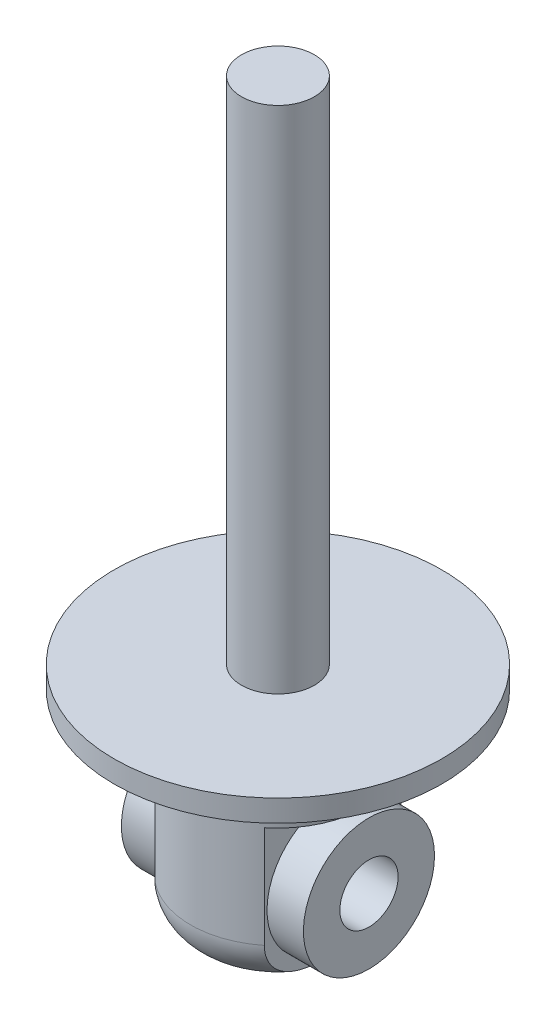
ISO-10303-21;
HEADER;
FILE_DESCRIPTION(('STEP AP214'),'2;1');
FILE_NAME('part.step','',(''),(''),'','','');
FILE_SCHEMA(('AUTOMOTIVE_DESIGN { 1 0 10303 214 1 1 1 1 }'));
ENDSEC;
DATA;
#1=APPLICATION_CONTEXT('core data for automotive mechanical design processes');
#2=APPLICATION_PROTOCOL_DEFINITION('international standard','automotive_design',2000,#1);
#3=PRODUCT_CONTEXT('',#1,'mechanical');
#4=PRODUCT('Part','Part','',(#3));
#5=PRODUCT_RELATED_PRODUCT_CATEGORY('part','',(#4));
#6=PRODUCT_DEFINITION_FORMATION('','',#4);
#7=PRODUCT_DEFINITION_CONTEXT('part definition',#1,'design');
#8=PRODUCT_DEFINITION('design','',#6,#7);
#9=PRODUCT_DEFINITION_SHAPE('','',#8);
#10=(LENGTH_UNIT() NAMED_UNIT(*) SI_UNIT(.MILLI.,.METRE.));
#11=(NAMED_UNIT(*) PLANE_ANGLE_UNIT() SI_UNIT($,.RADIAN.));
#12=(NAMED_UNIT(*) SI_UNIT($,.STERADIAN.) SOLID_ANGLE_UNIT());
#13=UNCERTAINTY_MEASURE_WITH_UNIT(LENGTH_MEASURE(1.E-05),#10,'distance_accuracy_value','');
#14=(GEOMETRIC_REPRESENTATION_CONTEXT(3) GLOBAL_UNCERTAINTY_ASSIGNED_CONTEXT((#13)) GLOBAL_UNIT_ASSIGNED_CONTEXT((#10,
#11,#12)) REPRESENTATION_CONTEXT('',''));
#15=CARTESIAN_POINT('',(0.,0.,0.));
#16=DIRECTION('',(0.,0.,1.));
#17=DIRECTION('',(1.,0.,0.));
#18=AXIS2_PLACEMENT_3D('',#15,#16,#17);
#19=CARTESIAN_POINT('',(-7.5,-8.00000000000001,-22.5));
#20=DIRECTION('',(1.,0.,0.));
#21=DIRECTION('',(0.,0.,-1.));
#22=AXIS2_PLACEMENT_3D('',#19,#20,#21);
#23=PLANE('',#22);
#24=CARTESIAN_POINT('',(-7.5,-27.8094750193111,0.));
#25=CARTESIAN_POINT('',(-7.5,-27.8094752958151,0.18452162824242));
#26=CARTESIAN_POINT('',(-7.5,-27.8077270322999,0.369043480287192));
#27=CARTESIAN_POINT('',(-7.5,-27.8006130628877,0.737999394292284));
#28=CARTESIAN_POINT('',(-7.5,-27.7952477367066,0.922433463434384));
#29=CARTESIAN_POINT('',(-7.5,-27.780538513706,1.29122559425462));
#30=CARTESIAN_POINT('',(-7.5,-27.7711929215574,1.47558358999919));
#31=CARTESIAN_POINT('',(-7.5,-27.7479507640883,1.84401846668315));
#32=CARTESIAN_POINT('',(-7.5,-27.734054140347,2.02809534398339));
#33=CARTESIAN_POINT('',(-7.5,-27.701027325669,2.39498843631837));
#34=CARTESIAN_POINT('',(-7.5,-27.6819201299087,2.57780665418326));
#35=CARTESIAN_POINT('',(-7.5,-27.6375682217561,2.94269408038083));
#36=CARTESIAN_POINT('',(-7.5,-27.6123230495969,3.12476323156505));
#37=CARTESIAN_POINT('',(-7.5,-27.5259360262262,3.6691632505479));
#38=CARTESIAN_POINT('',(-7.5,-27.4541196223952,4.02997739530099));
#39=CARTESIAN_POINT('',(-7.5,-27.315114172541,4.57935988961709));
#40=CARTESIAN_POINT('',(-7.5,-27.2608348848703,4.77122256452969));
#41=CARTESIAN_POINT('',(-7.5,-27.1402411036094,5.15109529504943));
#42=CARTESIAN_POINT('',(-7.5,-27.0739312594077,5.33910680786539));
#43=CARTESIAN_POINT('',(-7.5,-26.9281486989919,5.70992505463463));
#44=CARTESIAN_POINT('',(-7.5,-26.8486797977089,5.8927332791208));
#45=CARTESIAN_POINT('',(-7.5,-26.6756224712841,6.25155879665883));
#46=CARTESIAN_POINT('',(-7.5,-26.5820364486501,6.4275772388346));
#47=CARTESIAN_POINT('',(-7.5,-26.3958384208508,6.74413785402998));
#48=CARTESIAN_POINT('',(-7.5,-26.3053527427416,6.8859302136676));
#49=CARTESIAN_POINT('',(-7.5,-26.1136422044668,7.16205254122039));
#50=CARTESIAN_POINT('',(-7.5,-26.0124194056704,7.29638393401336));
#51=CARTESIAN_POINT('',(-7.5,-25.7991822855038,7.55627452274062));
#52=CARTESIAN_POINT('',(-7.5,-25.6871652583255,7.6818315054992));
#53=CARTESIAN_POINT('',(-7.5,-25.4525813942248,7.92270374400352));
#54=CARTESIAN_POINT('',(-7.5,-25.3300144777409,8.03801892249803));
#55=CARTESIAN_POINT('',(-7.5,-25.0736714823962,8.25792234562975));
#56=CARTESIAN_POINT('',(-7.5,-24.9398051473305,8.36240569865935));
#57=CARTESIAN_POINT('',(-7.5,-24.662616920615,8.55796576900282));
#58=CARTESIAN_POINT('',(-7.5,-24.5192963548439,8.64904436046083));
#59=CARTESIAN_POINT('',(-7.5,-24.2243409104845,8.81636481076627));
#60=CARTESIAN_POINT('',(-7.5,-24.0727112205184,8.89261579636784));
#61=CARTESIAN_POINT('',(-7.5,-23.7624095052739,9.02909243430965));
#62=CARTESIAN_POINT('',(-7.5,-23.6037388369551,9.08932115899453));
#63=CARTESIAN_POINT('',(-7.5,-23.3052245459151,9.1849514334904));
#64=CARTESIAN_POINT('',(-7.5,-23.1661361294911,9.22272405795734));
#65=CARTESIAN_POINT('',(-7.5,-22.8851087613884,9.28547940350164));
#66=CARTESIAN_POINT('',(-7.5,-22.7431701638949,9.31046370365637));
#67=CARTESIAN_POINT('',(-7.5,-22.4576599589478,9.34730641699016));
#68=CARTESIAN_POINT('',(-7.5,-22.3140890586128,9.35917031033292));
#69=CARTESIAN_POINT('',(-7.5,-22.0264648581988,9.36963164548865));
#70=CARTESIAN_POINT('',(-7.5,-21.8824115750842,9.36822954903947));
#71=CARTESIAN_POINT('',(-7.5,-21.6061914815275,9.35280339576898));
#72=CARTESIAN_POINT('',(-7.5,-21.4739684759153,9.33976569953801));
#73=CARTESIAN_POINT('',(-7.5,-21.2110534946456,9.30256363878721));
#74=CARTESIAN_POINT('',(-7.5,-21.0803620180608,9.27839574533066));
#75=CARTESIAN_POINT('',(-7.5,-20.8215410609612,9.21922065645586));
#76=CARTESIAN_POINT('',(-7.5,-20.6934101253726,9.1842198149556));
#77=CARTESIAN_POINT('',(-7.5,-20.4404340442512,9.1037455253616));
#78=CARTESIAN_POINT('',(-7.5,-20.3155901493276,9.05826815366643));
#79=CARTESIAN_POINT('',(-7.5,-20.0692031015505,8.95699564520569));
#80=CARTESIAN_POINT('',(-7.5,-19.9476868658852,8.90113499399755));
#81=CARTESIAN_POINT('',(-7.5,-19.7094920695403,8.77987692751896));
#82=CARTESIAN_POINT('',(-7.5,-19.5928152563103,8.71447610526943));
#83=CARTESIAN_POINT('',(-7.5,-19.2509911073174,8.50489875856371));
#84=CARTESIAN_POINT('',(-7.5,-19.0339195251877,8.34729299116934));
#85=CARTESIAN_POINT('',(-7.5,-18.609337427954,7.98870608163153));
#86=CARTESIAN_POINT('',(-7.5,-18.4039002281567,7.78529755950601));
#87=CARTESIAN_POINT('',(-7.5,-18.0246758733926,7.35109040646743));
#88=CARTESIAN_POINT('',(-7.5,-17.8508837047537,7.12029612399674));
#89=CARTESIAN_POINT('',(-7.5,-17.5744409595824,6.69864287979115));
#90=CARTESIAN_POINT('',(-7.5,-17.4648689537028,6.51223410047273));
#91=CARTESIAN_POINT('',(-7.5,-17.2626904112622,6.13034538679086));
#92=CARTESIAN_POINT('',(-7.5,-17.1700919878543,5.93486117014358));
#93=CARTESIAN_POINT('',(-7.5,-17.0006313082269,5.53658641063457));
#94=CARTESIAN_POINT('',(-7.5,-16.9238147555949,5.3337765932138));
#95=CARTESIAN_POINT('',(-7.5,-16.784875362625,4.9233142846081));
#96=CARTESIAN_POINT('',(-7.5,-16.7227484430634,4.71566315546474));
#97=CARTESIAN_POINT('',(-7.5,-16.5386673542946,4.02250667384635));
#98=CARTESIAN_POINT('',(-7.5,-16.4449803111871,3.52942656369881));
#99=CARTESIAN_POINT('',(-7.5,-16.3412352530644,2.78498720051466));
#100=CARTESIAN_POINT('',(-7.5,-16.3127705467372,2.53568557770049));
#101=CARTESIAN_POINT('',(-7.5,-16.2658269581612,2.03612434937438));
#102=CARTESIAN_POINT('',(-7.5,-16.2473468655649,1.78586486368141));
#103=CARTESIAN_POINT('',(-7.5,-16.2184283009414,1.28363112408652));
#104=CARTESIAN_POINT('',(-7.5,-16.208031590786,1.03165466176091));
#105=CARTESIAN_POINT('',(-7.5,-16.1941849220444,0.527501194688673));
#106=CARTESIAN_POINT('',(-7.5,-16.1907352988047,0.275324180848904));
#107=CARTESIAN_POINT('',(-7.5,-16.1903333462322,-0.228731345602983));
#108=CARTESIAN_POINT('',(-7.5,-16.193373232494,-0.480609853630182));
#109=CARTESIAN_POINT('',(-7.5,-16.2063332691715,-0.984173581494274));
#110=CARTESIAN_POINT('',(-7.5,-16.2162528039696,-1.23585881660875));
#111=CARTESIAN_POINT('',(-7.5,-16.2454935008677,-1.76278825668934));
#112=CARTESIAN_POINT('',(-7.5,-16.2656211327378,-2.03798990109172));
#113=CARTESIAN_POINT('',(-7.5,-16.3180418431018,-2.58731345976839));
#114=CARTESIAN_POINT('',(-7.5,-16.3503365349836,-2.86143522597444));
#115=CARTESIAN_POINT('',(-7.5,-16.4300545548583,-3.40623279358437));
#116=CARTESIAN_POINT('',(-7.5,-16.4774071358833,-3.67691867401873));
#117=CARTESIAN_POINT('',(-7.5,-16.5907053400646,-4.21439476079952));
#118=CARTESIAN_POINT('',(-7.5,-16.6566449229111,-4.4811862031647));
#119=CARTESIAN_POINT('',(-7.5,-16.7911834026755,-4.94217748017443));
#120=CARTESIAN_POINT('',(-7.5,-16.8549558474619,-5.13778160857807));
#121=CARTESIAN_POINT('',(-7.5,-16.9961265709521,-5.52399422741739));
#122=CARTESIAN_POINT('',(-7.5,-17.0735207892669,-5.71460418712136));
#123=CARTESIAN_POINT('',(-7.5,-17.2430793617625,-6.08921987221889));
#124=CARTESIAN_POINT('',(-7.5,-17.3352463319138,-6.27322442084438));
#125=CARTESIAN_POINT('',(-7.5,-17.5351759469553,-6.63256976145457));
#126=CARTESIAN_POINT('',(-7.5,-17.6429345063483,-6.80791280693598));
#127=CARTESIAN_POINT('',(-7.5,-17.8487615005736,-7.10989658300674));
#128=CARTESIAN_POINT('',(-7.5,-17.9436617626469,-7.23870103997639));
#129=CARTESIAN_POINT('',(-7.5,-18.143229826346,-7.48856622066219));
#130=CARTESIAN_POINT('',(-7.5,-18.2478987883735,-7.60962602152205));
#131=CARTESIAN_POINT('',(-7.5,-18.4668045949393,-7.84271387792474));
#132=CARTESIAN_POINT('',(-7.5,-18.5810384459287,-7.95474473789612));
#133=CARTESIAN_POINT('',(-7.5,-18.8187268203134,-8.16854933672494));
#134=CARTESIAN_POINT('',(-7.5,-18.9421800591116,-8.27032449994957));
#135=CARTESIAN_POINT('',(-7.5,-19.1987356397018,-8.46313596223061));
#136=CARTESIAN_POINT('',(-7.5,-19.3319055781875,-8.55408255407203));
#137=CARTESIAN_POINT('',(-7.5,-19.6061418402457,-8.72304401015934));
#138=CARTESIAN_POINT('',(-7.5,-19.747204378254,-8.80106500403696));
#139=CARTESIAN_POINT('',(-7.5,-20.0362068877473,-8.94309470867639));
#140=CARTESIAN_POINT('',(-7.5,-20.1841460034049,-9.00710515749598));
#141=CARTESIAN_POINT('',(-7.5,-20.4856380297523,-9.12014361193693));
#142=CARTESIAN_POINT('',(-7.5,-20.6391901444676,-9.16917373274798));
#143=CARTESIAN_POINT('',(-7.5,-20.9313639562727,-9.24643392787081));
#144=CARTESIAN_POINT('',(-7.5,-21.0695088202567,-9.27647685632879));
#145=CARTESIAN_POINT('',(-7.5,-21.3479315795213,-9.32406143536891));
#146=CARTESIAN_POINT('',(-7.5,-21.4882092809526,-9.34160421520928));
#147=CARTESIAN_POINT('',(-7.5,-21.769719609589,-9.36396002322679));
#148=CARTESIAN_POINT('',(-7.5,-21.9109518422674,-9.36877802253041));
#149=CARTESIAN_POINT('',(-7.5,-22.1932734390957,-9.3656361390626));
#150=CARTESIAN_POINT('',(-7.5,-22.3343628067459,-9.35767657732182));
#151=CARTESIAN_POINT('',(-7.5,-22.6064011749062,-9.32998563551062));
#152=CARTESIAN_POINT('',(-7.5,-22.7374295539783,-9.31102660205279));
#153=CARTESIAN_POINT('',(-7.5,-22.9974780227225,-9.26218788836622));
#154=CARTESIAN_POINT('',(-7.5,-23.1264974548056,-9.23230470755187));
#155=CARTESIAN_POINT('',(-7.5,-23.3815508516768,-9.16196479385525));
#156=CARTESIAN_POINT('',(-7.5,-23.5075862018083,-9.12151307666088));
#157=CARTESIAN_POINT('',(-7.5,-23.7559772755244,-9.03044888037393));
#158=CARTESIAN_POINT('',(-7.5,-23.8783315975104,-8.97983258590814));
#159=CARTESIAN_POINT('',(-7.5,-24.1205569584555,-8.8680617574251));
#160=CARTESIAN_POINT('',(-7.5,-24.2403549182387,-8.80674877020291));
#161=CARTESIAN_POINT('',(-7.5,-24.4747211723639,-8.67480187441993));
#162=CARTESIAN_POINT('',(-7.5,-24.5892875713423,-8.60416462323317));
#163=CARTESIAN_POINT('',(-7.5,-24.9242270275788,-8.37928997825773));
#164=CARTESIAN_POINT('',(-7.5,-25.13600210755,-8.21201407264852));
#165=CARTESIAN_POINT('',(-7.5,-25.5504485361803,-7.832942739178));
#166=CARTESIAN_POINT('',(-7.5,-25.7507010772538,-7.618532285847));
#167=CARTESIAN_POINT('',(-7.5,-26.1185076671662,-7.16337882817298));
#168=CARTESIAN_POINT('',(-7.5,-26.2860513710234,-6.9226275303298));
#169=CARTESIAN_POINT('',(-7.5,-26.5545024709803,-6.4788664395953));
#170=CARTESIAN_POINT('',(-7.5,-26.6619013252763,-6.279707295078));
#171=CARTESIAN_POINT('',(-7.5,-26.858559219587,-5.87254463104013));
#172=CARTESIAN_POINT('',(-7.5,-26.9478095430477,-5.66453691936401));
#173=CARTESIAN_POINT('',(-7.5,-27.1096214973705,-5.24180758530233));
#174=CARTESIAN_POINT('',(-7.5,-27.1821555960046,-5.02707553901332));
#175=CARTESIAN_POINT('',(-7.5,-27.3121001369762,-4.59305326757356));
#176=CARTESIAN_POINT('',(-7.5,-27.3695048137837,-4.37376133898657));
#177=CARTESIAN_POINT('',(-7.5,-27.4981886749365,-3.81417726059937));
#178=CARTESIAN_POINT('',(-7.5,-27.5604951716191,-3.47183296905169));
#179=CARTESIAN_POINT('',(-7.5,-27.6609019684328,-2.78359200614869));
#180=CARTESIAN_POINT('',(-7.5,-27.6989863972919,-2.43769315620305));
#181=CARTESIAN_POINT('',(-7.5,-27.7425563308733,-1.91723181279188));
#182=CARTESIAN_POINT('',(-7.5,-27.7548291128016,-1.74318957751326));
#183=CARTESIAN_POINT('',(-7.5,-27.7753986995787,-1.39487161182967));
#184=CARTESIAN_POINT('',(-7.5,-27.7836956019396,-1.22059588725638));
#185=CARTESIAN_POINT('',(-7.5,-27.796777523185,-0.871965392986039));
#186=CARTESIAN_POINT('',(-7.5,-27.8015635129394,-0.69761065849217));
#187=CARTESIAN_POINT('',(-7.5,-27.8079121855994,-0.348837350643893));
#188=CARTESIAN_POINT('',(-7.5,-27.8094747579462,-0.174418775305038));
#189=CARTESIAN_POINT('',(-7.5,-27.8094750193111,0.));
#190=B_SPLINE_CURVE_WITH_KNOTS('',3,(#24,#25,#26,#27,#28,#29,#30,#31,#32,#33,#34,#35,#36,#37,
#38,#39,#40,#41,#42,#43,#44,#45,#46,#47,#48,#49,#50,#51,#52,#53,#54,#55,#56,#57,#58,#59,#60,#61,
#62,#63,#64,#65,#66,#67,#68,#69,#70,#71,#72,#73,#74,#75,#76,#77,#78,#79,#80,#81,#82,#83,#84,#85,
#86,#87,#88,#89,#90,#91,#92,#93,#94,#95,#96,#97,#98,#99,#100,#101,#102,#103,#104,#105,#106,#107,
#108,#109,#110,#111,#112,#113,#114,#115,#116,#117,#118,#119,#120,#121,#122,#123,#124,#125,#126,
#127,#128,#129,#130,#131,#132,#133,#134,#135,#136,#137,#138,#139,#140,#141,#142,#143,#144,#145,
#146,#147,#148,#149,#150,#151,#152,#153,#154,#155,#156,#157,#158,#159,#160,#161,#162,#163,#164,
#165,#166,#167,#168,#169,#170,#171,#172,#173,#174,#175,#176,#177,#178,#179,#180,#181,#182,#183,
#184,#185,#186,#187,#188,#189),.UNSPECIFIED.,.T.,.F.,(4,2,2,2,2,2,2,2,2,2,2,2,2,2,2,2,2,2,2,2,2,
2,2,2,2,2,2,2,2,2,2,2,2,2,2,2,2,2,2,2,2,2,2,2,2,2,2,2,2,2,2,2,2,2,2,2,2,2,2,2,2,2,2,2,2,2,2,2,2,
2,2,2,2,2,2,2,2,2,2,2,2,2,4),(0.,0.553556541747908,1.10705498067111,1.66078940935171,
2.21453094651203,2.7658672034967,3.31724477121585,4.41912680182767,5.01698525599297,
5.61461314908642,6.21206808675635,6.80942146164093,7.31357153503217,7.81762499361292,
8.32180513447662,8.82598907791494,9.33467160980088,9.84328295415676,10.3515802378956,
10.8597799828438,11.291588037567,11.7233427606026,12.1549170790764,12.5864763761707,
12.9845986570771,13.3828472534997,13.7808627038906,14.1790274594522,14.579795450788,
14.9807069160888,15.7821103743006,16.6461503316802,17.5100532757815,18.1578732554314,
18.8060020817717,19.4559821948789,20.1057815998326,21.6069748462106,22.3596793389022,
23.1122925673176,23.8687687149109,24.625281377904,25.3808870860739,26.1364251884592,
26.9640249034878,27.7917343993232,28.6156111127982,29.4392203950451,30.0559954213972,
30.6725869093733,31.2892877047367,31.9058271963483,32.3853559200308,32.86494167852,
33.3443778968313,33.823747436381,34.3068464150843,34.7897156366604,35.2725249226045,
35.7552660053908,36.1788379642465,36.6023716529343,37.0257398573389,37.4490974249689,
37.8458122806135,38.2426543730445,38.639308470493,39.0361117351622,39.4393886143668,
39.8428104576492,40.6491243408277,41.5260051520067,42.4031628508039,43.0810551134699,
43.7592721958252,44.4385984678267,45.1181832448308,46.1608437011148,47.2041866484774,
47.7275747628343,48.2509500399341,48.7741805338585,49.2974289735857),.UNSPECIFIED.);
#191=CARTESIAN_POINT('',(-7.5,-22.,-9.3674969975976));
#192=VERTEX_POINT('',#191);
#193=CARTESIAN_POINT('',(-7.5,-21.9999999999999,9.36749699759766));
#194=VERTEX_POINT('',#193);
#195=EDGE_CURVE('E132',#192,#194,#190,.T.);
#196=ORIENTED_EDGE('',*,*,#195,.T.);
#197=DIRECTION('',(0.,1.,0.));
#198=VECTOR('',#197,1.);
#199=CARTESIAN_POINT('',(-7.5,-28.,9.3674969975976));
#200=LINE('',#199,#198);
#201=CARTESIAN_POINT('',(-7.5,-8.00000000000001,9.36749699759758));
#202=VERTEX_POINT('',#201);
#203=EDGE_CURVE('E95',#202,#194,#200,.F.);
#204=ORIENTED_EDGE('',*,*,#203,.F.);
#205=DIRECTION('',(0.,0.,1.));
#206=VECTOR('',#205,1.);
#207=CARTESIAN_POINT('',(-7.5,-8.00000000000001,-22.5));
#208=LINE('',#207,#206);
#209=CARTESIAN_POINT('',(-7.5,-8.00000000000001,-9.36749699759761));
#210=VERTEX_POINT('',#209);
#211=EDGE_CURVE('E88',#210,#202,#208,.T.);
#212=ORIENTED_EDGE('',*,*,#211,.F.);
#213=DIRECTION('',(0.,1.,0.));
#214=VECTOR('',#213,1.);
#215=CARTESIAN_POINT('',(-7.5,-28.,-9.3674969975976));
#216=LINE('',#215,#214);
#217=EDGE_CURVE('E66',#192,#210,#216,.T.);
#218=ORIENTED_EDGE('',*,*,#217,.F.);
#219=EDGE_LOOP('',(#196,#204,#212,#218));
#220=FACE_BOUND('',#219,.T.);
#221=CARTESIAN_POINT('',(-7.5,-18.,0.));
#222=DIRECTION('',(1.,0.,0.));
#223=DIRECTION('',(0.,0.,-1.));
#224=AXIS2_PLACEMENT_3D('',#221,#222,#223);
#225=CIRCLE('',#224,9.);
#226=CARTESIAN_POINT('',(-7.5,-18.,-9.));
#227=VERTEX_POINT('',#226);
#228=EDGE_CURVE('E11',#227,#227,#225,.F.);
#229=ORIENTED_EDGE('',*,*,#228,.F.);
#230=EDGE_LOOP('',(#229));
#231=FACE_BOUND('',#230,.T.);
#232=ADVANCED_FACE('F41',(#220,#231),#23,.F.);
#233=CARTESIAN_POINT('',(7.5,-8.,-22.5));
#234=DIRECTION('',(-1.,0.,0.));
#235=DIRECTION('',(0.,-1.,0.));
#236=AXIS2_PLACEMENT_3D('',#233,#234,#235);
#237=PLANE('',#236);
#238=CARTESIAN_POINT('',(7.50000000000001,-27.8094750193111,0.));
#239=CARTESIAN_POINT('',(7.50000000000001,-27.8094752958151,-0.18452162824242));
#240=CARTESIAN_POINT('',(7.50000000000001,-27.8077270322999,-0.369043480287192));
#241=CARTESIAN_POINT('',(7.50000000000001,-27.8006130628877,-0.737999394292286));
#242=CARTESIAN_POINT('',(7.50000000000001,-27.7952477367066,-0.922433463434386));
#243=CARTESIAN_POINT('',(7.50000000000001,-27.780538513706,-1.29122559425462));
#244=CARTESIAN_POINT('',(7.50000000000001,-27.7711929215574,-1.47558358999919));
#245=CARTESIAN_POINT('',(7.50000000000001,-27.7479507640883,-1.84401846668315));
#246=CARTESIAN_POINT('',(7.50000000000001,-27.734054140347,-2.0280953439834));
#247=CARTESIAN_POINT('',(7.50000000000001,-27.701027325669,-2.39498843631837));
#248=CARTESIAN_POINT('',(7.50000000000001,-27.6819201299087,-2.57780665418327));
#249=CARTESIAN_POINT('',(7.50000000000001,-27.6375682217561,-2.94269408038084));
#250=CARTESIAN_POINT('',(7.50000000000001,-27.6123230495969,-3.12476323156505));
#251=CARTESIAN_POINT('',(7.50000000000001,-27.5259360262262,-3.6691632505479));
#252=CARTESIAN_POINT('',(7.50000000000001,-27.4541196223952,-4.029977395301));
#253=CARTESIAN_POINT('',(7.50000000000001,-27.315114172541,-4.57935988961709));
#254=CARTESIAN_POINT('',(7.50000000000001,-27.2608348848703,-4.7712225645297));
#255=CARTESIAN_POINT('',(7.50000000000001,-27.1402411036094,-5.15109529504943));
#256=CARTESIAN_POINT('',(7.50000000000001,-27.0739312594077,-5.3391068078654));
#257=CARTESIAN_POINT('',(7.50000000000001,-26.9281486989919,-5.70992505463464));
#258=CARTESIAN_POINT('',(7.50000000000001,-26.8486797977089,-5.89273327912081));
#259=CARTESIAN_POINT('',(7.50000000000001,-26.6756224712841,-6.25155879665884));
#260=CARTESIAN_POINT('',(7.50000000000001,-26.5820364486501,-6.4275772388346));
#261=CARTESIAN_POINT('',(7.50000000000001,-26.3958384208508,-6.74413785402998));
#262=CARTESIAN_POINT('',(7.5,-26.3053527427416,-6.8859302136676));
#263=CARTESIAN_POINT('',(7.5,-26.1136422044668,-7.16205254122039));
#264=CARTESIAN_POINT('',(7.5,-26.0124194056704,-7.29638393401337));
#265=CARTESIAN_POINT('',(7.5,-25.7991822855038,-7.55627452274062));
#266=CARTESIAN_POINT('',(7.5,-25.6871652583255,-7.6818315054992));
#267=CARTESIAN_POINT('',(7.5,-25.4525813942248,-7.92270374400352));
#268=CARTESIAN_POINT('',(7.5,-25.3300144777409,-8.03801892249803));
#269=CARTESIAN_POINT('',(7.5,-25.0736714823962,-8.25792234562975));
#270=CARTESIAN_POINT('',(7.5,-24.9398051473305,-8.36240569865935));
#271=CARTESIAN_POINT('',(7.5,-24.662616920615,-8.55796576900282));
#272=CARTESIAN_POINT('',(7.5,-24.5192963548439,-8.64904436046083));
#273=CARTESIAN_POINT('',(7.5,-24.2243409104845,-8.81636481076626));
#274=CARTESIAN_POINT('',(7.5,-24.0727112205184,-8.89261579636783));
#275=CARTESIAN_POINT('',(7.5,-23.7624095052739,-9.02909243430965));
#276=CARTESIAN_POINT('',(7.5,-23.6037388369551,-9.08932115899453));
#277=CARTESIAN_POINT('',(7.5,-23.3052245459151,-9.1849514334904));
#278=CARTESIAN_POINT('',(7.5,-23.166136129491,-9.22272405795733));
#279=CARTESIAN_POINT('',(7.5,-22.8851087613884,-9.28547940350164));
#280=CARTESIAN_POINT('',(7.5,-22.7431701638949,-9.31046370365637));
#281=CARTESIAN_POINT('',(7.5,-22.4576599589478,-9.34730641699015));
#282=CARTESIAN_POINT('',(7.5,-22.3140890586128,-9.35917031033291));
#283=CARTESIAN_POINT('',(7.5,-22.0264648581988,-9.36963164548865));
#284=CARTESIAN_POINT('',(7.5,-21.8824115750842,-9.36822954903947));
#285=CARTESIAN_POINT('',(7.5,-21.6061914815275,-9.35280339576898));
#286=CARTESIAN_POINT('',(7.5,-21.4739684759153,-9.33976569953801));
#287=CARTESIAN_POINT('',(7.5,-21.2110534946456,-9.3025636387872));
#288=CARTESIAN_POINT('',(7.5,-21.0803620180608,-9.27839574533065));
#289=CARTESIAN_POINT('',(7.5,-20.8215410609612,-9.21922065645585));
#290=CARTESIAN_POINT('',(7.5,-20.6934101253726,-9.1842198149556));
#291=CARTESIAN_POINT('',(7.5,-20.4404340442512,-9.1037455253616));
#292=CARTESIAN_POINT('',(7.5,-20.3155901493276,-9.05826815366643));
#293=CARTESIAN_POINT('',(7.5,-20.0692031015505,-8.95699564520569));
#294=CARTESIAN_POINT('',(7.5,-19.9476868658852,-8.90113499399755));
#295=CARTESIAN_POINT('',(7.5,-19.7094920695403,-8.77987692751896));
#296=CARTESIAN_POINT('',(7.5,-19.5928152563103,-8.71447610526942));
#297=CARTESIAN_POINT('',(7.5,-19.2509911073174,-8.50489875856371));
#298=CARTESIAN_POINT('',(7.5,-19.0339195251877,-8.34729299116934));
#299=CARTESIAN_POINT('',(7.5,-18.609337427954,-7.98870608163152));
#300=CARTESIAN_POINT('',(7.5,-18.4039002281567,-7.785297559506));
#301=CARTESIAN_POINT('',(7.5,-18.0246758733926,-7.35109040646742));
#302=CARTESIAN_POINT('',(7.5,-17.8508837047537,-7.12029612399673));
#303=CARTESIAN_POINT('',(7.5,-17.5744409595824,-6.69864287979114));
#304=CARTESIAN_POINT('',(7.5,-17.4648689537028,-6.51223410047272));
#305=CARTESIAN_POINT('',(7.5,-17.2626904112622,-6.13034538679085));
#306=CARTESIAN_POINT('',(7.5,-17.1700919878543,-5.93486117014358));
#307=CARTESIAN_POINT('',(7.5,-17.0006313082269,-5.53658641063457));
#308=CARTESIAN_POINT('',(7.5,-16.9238147555949,-5.33377659321379));
#309=CARTESIAN_POINT('',(7.5,-16.784875362625,-4.92331428460809));
#310=CARTESIAN_POINT('',(7.5,-16.7227484430634,-4.71566315546473));
#311=CARTESIAN_POINT('',(7.5,-16.5386673542946,-4.02250667384634));
#312=CARTESIAN_POINT('',(7.5,-16.4449803111871,-3.52942656369881));
#313=CARTESIAN_POINT('',(7.5,-16.3412352530644,-2.78498720051465));
#314=CARTESIAN_POINT('',(7.5,-16.3127705467372,-2.53568557770049));
#315=CARTESIAN_POINT('',(7.5,-16.2658269581612,-2.03612434937437));
#316=CARTESIAN_POINT('',(7.5,-16.2473468655649,-1.78586486368141));
#317=CARTESIAN_POINT('',(7.5,-16.2184283009414,-1.28363112408651));
#318=CARTESIAN_POINT('',(7.5,-16.208031590786,-1.0316546617609));
#319=CARTESIAN_POINT('',(7.5,-16.1941849220444,-0.52750119468867));
#320=CARTESIAN_POINT('',(7.5,-16.1907352988047,-0.275324180848901));
#321=CARTESIAN_POINT('',(7.5,-16.1903333462322,0.228731345602988));
#322=CARTESIAN_POINT('',(7.5,-16.193373232494,0.480609853630186));
#323=CARTESIAN_POINT('',(7.5,-16.2063332691715,0.984173581494278));
#324=CARTESIAN_POINT('',(7.5,-16.2162528039696,1.23585881660875));
#325=CARTESIAN_POINT('',(7.5,-16.2454935008677,1.76278825668934));
#326=CARTESIAN_POINT('',(7.5,-16.2656211327378,2.03798990109172));
#327=CARTESIAN_POINT('',(7.5,-16.3180418431018,2.58731345976839));
#328=CARTESIAN_POINT('',(7.5,-16.3503365349836,2.86143522597444));
#329=CARTESIAN_POINT('',(7.5,-16.4300545548583,3.40623279358437));
#330=CARTESIAN_POINT('',(7.5,-16.4774071358833,3.67691867401874));
#331=CARTESIAN_POINT('',(7.5,-16.5907053400646,4.21439476079952));
#332=CARTESIAN_POINT('',(7.5,-16.6566449229111,4.4811862031647));
#333=CARTESIAN_POINT('',(7.5,-16.7911834026755,4.94217748017443));
#334=CARTESIAN_POINT('',(7.5,-16.8549558474619,5.13778160857807));
#335=CARTESIAN_POINT('',(7.5,-16.9961265709521,5.5239942274174));
#336=CARTESIAN_POINT('',(7.5,-17.073520789267,5.71460418712137));
#337=CARTESIAN_POINT('',(7.5,-17.2430793617625,6.08921987221889));
#338=CARTESIAN_POINT('',(7.5,-17.3352463319138,6.27322442084438));
#339=CARTESIAN_POINT('',(7.5,-17.5351759469553,6.63256976145457));
#340=CARTESIAN_POINT('',(7.5,-17.6429345063483,6.80791280693598));
#341=CARTESIAN_POINT('',(7.5,-17.8487615005737,7.10989658300674));
#342=CARTESIAN_POINT('',(7.5,-17.9436617626469,7.23870103997639));
#343=CARTESIAN_POINT('',(7.5,-18.143229826346,7.48856622066219));
#344=CARTESIAN_POINT('',(7.5,-18.2478987883735,7.60962602152205));
#345=CARTESIAN_POINT('',(7.5,-18.4668045949393,7.84271387792474));
#346=CARTESIAN_POINT('',(7.5,-18.5810384459287,7.95474473789612));
#347=CARTESIAN_POINT('',(7.5,-18.8187268203134,8.16854933672494));
#348=CARTESIAN_POINT('',(7.5,-18.9421800591116,8.27032449994956));
#349=CARTESIAN_POINT('',(7.5,-19.1987356397018,8.46313596223061));
#350=CARTESIAN_POINT('',(7.5,-19.3319055781875,8.55408255407202));
#351=CARTESIAN_POINT('',(7.5,-19.6061418402457,8.72304401015933));
#352=CARTESIAN_POINT('',(7.5,-19.747204378254,8.80106500403695));
#353=CARTESIAN_POINT('',(7.5,-20.0362068877473,8.94309470867638));
#354=CARTESIAN_POINT('',(7.5,-20.1841460034049,9.00710515749597));
#355=CARTESIAN_POINT('',(7.5,-20.4856380297523,9.12014361193692));
#356=CARTESIAN_POINT('',(7.5,-20.6391901444676,9.16917373274798));
#357=CARTESIAN_POINT('',(7.5,-20.9313639562727,9.24643392787081));
#358=CARTESIAN_POINT('',(7.5,-21.0695088202567,9.27647685632879));
#359=CARTESIAN_POINT('',(7.5,-21.3479315795213,9.32406143536891));
#360=CARTESIAN_POINT('',(7.5,-21.4882092809527,9.34160421520927));
#361=CARTESIAN_POINT('',(7.5,-21.769719609589,9.36396002322678));
#362=CARTESIAN_POINT('',(7.5,-21.9109518422674,9.36877802253041));
#363=CARTESIAN_POINT('',(7.5,-22.1932734390957,9.3656361390626));
#364=CARTESIAN_POINT('',(7.5,-22.3343628067459,9.35767657732181));
#365=CARTESIAN_POINT('',(7.5,-22.6064011749062,9.32998563551062));
#366=CARTESIAN_POINT('',(7.5,-22.7374295539783,9.31102660205278));
#367=CARTESIAN_POINT('',(7.5,-22.9974780227225,9.26218788836621));
#368=CARTESIAN_POINT('',(7.5,-23.1264974548056,9.23230470755187));
#369=CARTESIAN_POINT('',(7.5,-23.3815508516768,9.16196479385525));
#370=CARTESIAN_POINT('',(7.5,-23.5075862018083,9.12151307666088));
#371=CARTESIAN_POINT('',(7.5,-23.7559772755244,9.03044888037393));
#372=CARTESIAN_POINT('',(7.5,-23.8783315975104,8.97983258590813));
#373=CARTESIAN_POINT('',(7.5,-24.1205569584555,8.86806175742509));
#374=CARTESIAN_POINT('',(7.5,-24.2403549182387,8.8067487702029));
#375=CARTESIAN_POINT('',(7.5,-24.4747211723639,8.67480187441992));
#376=CARTESIAN_POINT('',(7.5,-24.5892875713423,8.60416462323316));
#377=CARTESIAN_POINT('',(7.5,-24.9242270275788,8.37928997825773));
#378=CARTESIAN_POINT('',(7.5,-25.13600210755,8.21201407264851));
#379=CARTESIAN_POINT('',(7.5,-25.5504485361803,7.832942739178));
#380=CARTESIAN_POINT('',(7.5,-25.7507010772538,7.61853228584699));
#381=CARTESIAN_POINT('',(7.5,-26.1185076671662,7.16337882817298));
#382=CARTESIAN_POINT('',(7.50000000000001,-26.2860513710234,6.92262753032979));
#383=CARTESIAN_POINT('',(7.50000000000001,-26.5545024709803,6.47886643959529));
#384=CARTESIAN_POINT('',(7.50000000000001,-26.6619013252763,6.27970729507799));
#385=CARTESIAN_POINT('',(7.50000000000001,-26.858559219587,5.87254463104012));
#386=CARTESIAN_POINT('',(7.50000000000001,-26.9478095430477,5.664536919364));
#387=CARTESIAN_POINT('',(7.50000000000001,-27.1096214973705,5.24180758530232));
#388=CARTESIAN_POINT('',(7.50000000000001,-27.1821555960046,5.02707553901331));
#389=CARTESIAN_POINT('',(7.50000000000001,-27.3121001369762,4.59305326757355));
#390=CARTESIAN_POINT('',(7.50000000000001,-27.3695048137837,4.37376133898656));
#391=CARTESIAN_POINT('',(7.50000000000001,-27.4981886749365,3.81417726059936));
#392=CARTESIAN_POINT('',(7.50000000000001,-27.5604951716191,3.47183296905169));
#393=CARTESIAN_POINT('',(7.50000000000001,-27.6609019684328,2.78359200614869));
#394=CARTESIAN_POINT('',(7.50000000000001,-27.6989863972919,2.43769315620305));
#395=CARTESIAN_POINT('',(7.50000000000001,-27.7425563308733,1.91723181279187));
#396=CARTESIAN_POINT('',(7.50000000000001,-27.7548291128016,1.74318957751326));
#397=CARTESIAN_POINT('',(7.50000000000001,-27.7753986995787,1.39487161182967));
#398=CARTESIAN_POINT('',(7.50000000000001,-27.7836956019396,1.22059588725638));
#399=CARTESIAN_POINT('',(7.50000000000001,-27.796777523185,0.871965392986041));
#400=CARTESIAN_POINT('',(7.50000000000001,-27.8015635129394,0.697610658492173));
#401=CARTESIAN_POINT('',(7.50000000000001,-27.8079121855994,0.348837350643895));
#402=CARTESIAN_POINT('',(7.50000000000001,-27.8094747579462,0.174418775305039));
#403=CARTESIAN_POINT('',(7.50000000000001,-27.8094750193111,0.));
#404=B_SPLINE_CURVE_WITH_KNOTS('',3,(#238,#239,#240,#241,#242,#243,#244,#245,#246,#247,#248,
#249,#250,#251,#252,#253,#254,#255,#256,#257,#258,#259,#260,#261,#262,#263,#264,#265,#266,#267,
#268,#269,#270,#271,#272,#273,#274,#275,#276,#277,#278,#279,#280,#281,#282,#283,#284,#285,#286,
#287,#288,#289,#290,#291,#292,#293,#294,#295,#296,#297,#298,#299,#300,#301,#302,#303,#304,#305,
#306,#307,#308,#309,#310,#311,#312,#313,#314,#315,#316,#317,#318,#319,#320,#321,#322,#323,#324,
#325,#326,#327,#328,#329,#330,#331,#332,#333,#334,#335,#336,#337,#338,#339,#340,#341,#342,#343,
#344,#345,#346,#347,#348,#349,#350,#351,#352,#353,#354,#355,#356,#357,#358,#359,#360,#361,#362,
#363,#364,#365,#366,#367,#368,#369,#370,#371,#372,#373,#374,#375,#376,#377,#378,#379,#380,#381,
#382,#383,#384,#385,#386,#387,#388,#389,#390,#391,#392,#393,#394,#395,#396,#397,#398,#399,#400,
#401,#402,#403),.UNSPECIFIED.,.T.,.F.,(4,2,2,2,2,2,2,2,2,2,2,2,2,2,2,2,2,2,2,2,2,2,2,2,2,2,2,2,
2,2,2,2,2,2,2,2,2,2,2,2,2,2,2,2,2,2,2,2,2,2,2,2,2,2,2,2,2,2,2,2,2,2,2,2,2,2,2,2,2,2,2,2,2,2,2,2,
2,2,2,2,2,2,4),(0.,0.553556541747909,1.10705498067111,1.66078940935171,2.21453094651203,
2.7658672034967,3.31724477121586,4.41912680182767,5.01698525599298,5.61461314908643,
6.21206808675635,6.80942146164093,7.31357153503218,7.81762499361293,8.32180513447663,
8.82598907791494,9.33467160980089,9.84328295415676,10.3515802378956,10.8597799828438,
11.291588037567,11.7233427606026,12.1549170790764,12.5864763761707,12.9845986570771,
13.3828472534997,13.7808627038906,14.1790274594522,14.579795450788,14.9807069160888,
15.7821103743006,16.6461503316802,17.5100532757815,18.1578732554314,18.8060020817716,
19.4559821948789,20.1057815998326,21.6069748462106,22.3596793389022,23.1122925673176,
23.8687687149109,24.6252813779039,25.3808870860739,26.1364251884592,26.9640249034878,
27.7917343993232,28.6156111127982,29.4392203950451,30.0559954213972,30.6725869093733,
31.2892877047367,31.9058271963483,32.3853559200308,32.8649416785199,33.3443778968313,
33.823747436381,34.3068464150843,34.7897156366603,35.2725249226045,35.7552660053908,
36.1788379642465,36.6023716529343,37.0257398573389,37.4490974249689,37.8458122806135,
38.2426543730445,38.6393084704929,39.0361117351622,39.4393886143668,39.8428104576491,
40.6491243408277,41.5260051520067,42.4031628508039,43.0810551134699,43.7592721958252,
44.4385984678267,45.1181832448308,46.1608437011148,47.2041866484774,47.7275747628343,
48.2509500399341,48.7741805338585,49.2974289735857),.UNSPECIFIED.);
#405=CARTESIAN_POINT('',(7.5,-22.,9.3674969975976));
#406=VERTEX_POINT('',#405);
#407=CARTESIAN_POINT('',(7.5,-21.9999999999999,-9.36749699759765));
#408=VERTEX_POINT('',#407);
#409=EDGE_CURVE('E92',#406,#408,#404,.T.);
#410=ORIENTED_EDGE('',*,*,#409,.T.);
#411=DIRECTION('',(0.,1.,0.));
#412=VECTOR('',#411,1.);
#413=CARTESIAN_POINT('',(7.5,-28.,-9.3674969975976));
#414=LINE('',#413,#412);
#415=CARTESIAN_POINT('',(7.5,-8.,-9.3674969975976));
#416=VERTEX_POINT('',#415);
#417=EDGE_CURVE('E106',#416,#408,#414,.F.);
#418=ORIENTED_EDGE('',*,*,#417,.F.);
#419=DIRECTION('',(0.,0.,1.));
#420=VECTOR('',#419,1.);
#421=CARTESIAN_POINT('',(7.5,-8.,-22.5));
#422=LINE('',#421,#420);
#423=CARTESIAN_POINT('',(7.5,-8.,9.3674969975976));
#424=VERTEX_POINT('',#423);
#425=EDGE_CURVE('E96',#416,#424,#422,.T.);
#426=ORIENTED_EDGE('',*,*,#425,.T.);
#427=DIRECTION('',(0.,1.,0.));
#428=VECTOR('',#427,1.);
#429=CARTESIAN_POINT('',(7.5,-28.,9.3674969975976));
#430=LINE('',#429,#428);
#431=EDGE_CURVE('E58',#406,#424,#430,.T.);
#432=ORIENTED_EDGE('',*,*,#431,.F.);
#433=EDGE_LOOP('',(#410,#418,#426,#432));
#434=FACE_BOUND('',#433,.T.);
#435=CARTESIAN_POINT('',(7.5,-18.,0.));
#436=DIRECTION('',(-1.,0.,0.));
#437=DIRECTION('',(0.,-1.,0.));
#438=AXIS2_PLACEMENT_3D('',#435,#436,#437);
#439=CIRCLE('',#438,9.);
#440=CARTESIAN_POINT('',(7.50000000000001,-27.,0.));
#441=VERTEX_POINT('',#440);
#442=EDGE_CURVE('E46',#441,#441,#439,.F.);
#443=ORIENTED_EDGE('',*,*,#442,.F.);
#444=EDGE_LOOP('',(#443));
#445=FACE_BOUND('',#444,.T.);
#446=ADVANCED_FACE('F146',(#434,#445),#237,.F.);
#447=CARTESIAN_POINT('',(0.,3.,0.));
#448=DIRECTION('',(0.,-1.,0.));
#449=DIRECTION('',(0.,0.,-1.));
#450=AXIS2_PLACEMENT_3D('',#447,#448,#449);
#451=CYLINDRICAL_SURFACE('',#450,22.5);
#452=CARTESIAN_POINT('',(0.,3.,0.));
#453=DIRECTION('',(0.,1.,0.));
#454=DIRECTION('',(0.,0.,1.));
#455=AXIS2_PLACEMENT_3D('',#452,#453,#454);
#456=CIRCLE('',#455,22.5);
#457=CARTESIAN_POINT('',(0.,3.,22.5));
#458=VERTEX_POINT('',#457);
#459=EDGE_CURVE('E123',#458,#458,#456,.T.);
#460=ORIENTED_EDGE('',*,*,#459,.F.);
#461=EDGE_LOOP('',(#460));
#462=FACE_BOUND('',#461,.T.);
#463=CARTESIAN_POINT('',(0.,0.,0.));
#464=DIRECTION('',(0.,1.,0.));
#465=DIRECTION('',(0.,0.,1.));
#466=AXIS2_PLACEMENT_3D('',#463,#464,#465);
#467=CIRCLE('',#466,22.5);
#468=CARTESIAN_POINT('',(0.,0.,22.5));
#469=VERTEX_POINT('',#468);
#470=EDGE_CURVE('E120',#469,#469,#467,.T.);
#471=ORIENTED_EDGE('',*,*,#470,.T.);
#472=EDGE_LOOP('',(#471));
#473=FACE_BOUND('',#472,.T.);
#474=ADVANCED_FACE('F168',(#462,#473),#451,.T.);
#475=CARTESIAN_POINT('',(0.,3.,0.));
#476=DIRECTION('',(0.,1.,0.));
#477=DIRECTION('',(0.,0.,1.));
#478=AXIS2_PLACEMENT_3D('',#475,#476,#477);
#479=PLANE('',#478);
#480=CARTESIAN_POINT('',(0.,3.,0.));
#481=DIRECTION('',(0.,1.,0.));
#482=DIRECTION('',(0.,0.,1.));
#483=AXIS2_PLACEMENT_3D('',#480,#481,#482);
#484=CIRCLE('',#483,5.);
#485=CARTESIAN_POINT('',(0.,3.,5.));
#486=VERTEX_POINT('',#485);
#487=EDGE_CURVE('E117',#486,#486,#484,.T.);
#488=ORIENTED_EDGE('',*,*,#487,.F.);
#489=EDGE_LOOP('',(#488));
#490=FACE_BOUND('',#489,.T.);
#491=ORIENTED_EDGE('',*,*,#459,.T.);
#492=EDGE_LOOP('',(#491));
#493=FACE_BOUND('',#492,.T.);
#494=ADVANCED_FACE('F165',(#490,#493),#479,.T.);
#495=CARTESIAN_POINT('',(0.,0.,0.));
#496=DIRECTION('',(0.,1.,0.));
#497=DIRECTION('',(0.,0.,1.));
#498=AXIS2_PLACEMENT_3D('',#495,#496,#497);
#499=PLANE('',#498);
#500=CARTESIAN_POINT('',(0.,0.,0.));
#501=DIRECTION('',(0.,-1.,0.));
#502=DIRECTION('',(0.,0.,-1.));
#503=AXIS2_PLACEMENT_3D('',#500,#501,#502);
#504=CIRCLE('',#503,12.);
#505=CARTESIAN_POINT('',(0.,0.,-12.));
#506=VERTEX_POINT('',#505);
#507=EDGE_CURVE('E113',#506,#506,#504,.T.);
#508=ORIENTED_EDGE('',*,*,#507,.F.);
#509=EDGE_LOOP('',(#508));
#510=FACE_BOUND('',#509,.T.);
#511=ORIENTED_EDGE('',*,*,#470,.F.);
#512=EDGE_LOOP('',(#511));
#513=FACE_BOUND('',#512,.T.);
#514=ADVANCED_FACE('F163',(#510,#513),#499,.F.);
#515=CARTESIAN_POINT('',(0.,73.,0.));
#516=DIRECTION('',(0.,-1.,0.));
#517=DIRECTION('',(0.,0.,-1.));
#518=AXIS2_PLACEMENT_3D('',#515,#516,#517);
#519=CYLINDRICAL_SURFACE('',#518,5.);
#520=CARTESIAN_POINT('',(0.,73.,0.));
#521=DIRECTION('',(0.,1.,0.));
#522=DIRECTION('',(0.,0.,1.));
#523=AXIS2_PLACEMENT_3D('',#520,#521,#522);
#524=CIRCLE('',#523,5.);
#525=CARTESIAN_POINT('',(0.,73.,5.));
#526=VERTEX_POINT('',#525);
#527=EDGE_CURVE('E112',#526,#526,#524,.T.);
#528=ORIENTED_EDGE('',*,*,#527,.F.);
#529=EDGE_LOOP('',(#528));
#530=FACE_BOUND('',#529,.T.);
#531=ORIENTED_EDGE('',*,*,#487,.T.);
#532=EDGE_LOOP('',(#531));
#533=FACE_BOUND('',#532,.T.);
#534=ADVANCED_FACE('F159',(#530,#533),#519,.T.);
#535=CARTESIAN_POINT('',(0.,73.,0.));
#536=DIRECTION('',(0.,1.,0.));
#537=DIRECTION('',(0.,0.,1.));
#538=AXIS2_PLACEMENT_3D('',#535,#536,#537);
#539=PLANE('',#538);
#540=ORIENTED_EDGE('',*,*,#527,.T.);
#541=EDGE_LOOP('',(#540));
#542=FACE_BOUND('',#541,.T.);
#543=ADVANCED_FACE('F156',(#542),#539,.T.);
#544=CARTESIAN_POINT('',(0.,-28.,0.));
#545=DIRECTION('',(0.,1.,0.));
#546=DIRECTION('',(0.,0.,1.));
#547=AXIS2_PLACEMENT_3D('',#544,#545,#546);
#548=CYLINDRICAL_SURFACE('',#547,12.);
#549=CARTESIAN_POINT('',(0.,-22.,0.));
#550=DIRECTION('',(0.,-1.,0.));
#551=DIRECTION('',(0.,0.,-1.));
#552=AXIS2_PLACEMENT_3D('',#549,#550,#551);
#553=CIRCLE('',#552,12.);
#554=EDGE_CURVE('E131',#194,#406,#553,.F.);
#555=ORIENTED_EDGE('',*,*,#554,.T.);
#556=ORIENTED_EDGE('',*,*,#431,.T.);
#557=CARTESIAN_POINT('',(0.,-8.,0.));
#558=DIRECTION('',(0.,1.,0.));
#559=DIRECTION('',(-1.,0.,0.));
#560=AXIS2_PLACEMENT_3D('',#557,#558,#559);
#561=CIRCLE('',#560,12.);
#562=EDGE_CURVE('E91',#424,#416,#561,.T.);
#563=ORIENTED_EDGE('',*,*,#562,.T.);
#564=ORIENTED_EDGE('',*,*,#417,.T.);
#565=EDGE_CURVE('E105',#408,#192,#553,.F.);
#566=ORIENTED_EDGE('',*,*,#565,.T.);
#567=ORIENTED_EDGE('',*,*,#217,.T.);
#568=CARTESIAN_POINT('',(0.,-8.,0.));
#569=DIRECTION('',(0.,1.,0.));
#570=DIRECTION('',(-1.,0.,0.));
#571=AXIS2_PLACEMENT_3D('',#568,#569,#570);
#572=CIRCLE('',#571,12.);
#573=EDGE_CURVE('E86',#210,#202,#572,.T.);
#574=ORIENTED_EDGE('',*,*,#573,.T.);
#575=ORIENTED_EDGE('',*,*,#203,.T.);
#576=EDGE_LOOP('',(#555,#556,#563,#564,#566,#567,#574,#575));
#577=FACE_BOUND('',#576,.T.);
#578=ORIENTED_EDGE('',*,*,#507,.T.);
#579=EDGE_LOOP('',(#578));
#580=FACE_BOUND('',#579,.T.);
#581=ADVANCED_FACE('F101',(#577,#580),#548,.T.);
#582=CARTESIAN_POINT('',(0.,-28.,0.));
#583=DIRECTION('',(0.,-1.,0.));
#584=DIRECTION('',(0.,0.,-1.));
#585=AXIS2_PLACEMENT_3D('',#582,#583,#584);
#586=PLANE('',#585);
#587=CARTESIAN_POINT('',(0.,-28.,0.));
#588=DIRECTION('',(0.,-1.,0.));
#589=DIRECTION('',(0.,0.,-1.));
#590=AXIS2_PLACEMENT_3D('',#587,#588,#589);
#591=CIRCLE('',#590,6.);
#592=CARTESIAN_POINT('',(0.,-28.,-6.));
#593=VERTEX_POINT('',#592);
#594=EDGE_CURVE('E116',#593,#593,#591,.T.);
#595=ORIENTED_EDGE('',*,*,#594,.T.);
#596=EDGE_LOOP('',(#595));
#597=FACE_BOUND('',#596,.T.);
#598=ADVANCED_FACE('F150',(#597),#586,.T.);
#599=CARTESIAN_POINT('',(0.,-22.,0.));
#600=DIRECTION('',(0.,-1.,0.));
#601=DIRECTION('',(0.,0.,-1.));
#602=AXIS2_PLACEMENT_3D('',#599,#600,#601);
#603=TOROIDAL_SURFACE('',#602,6.,6.);
#604=ORIENTED_EDGE('',*,*,#409,.F.);
#605=ORIENTED_EDGE('',*,*,#554,.F.);
#606=ORIENTED_EDGE('',*,*,#195,.F.);
#607=ORIENTED_EDGE('',*,*,#565,.F.);
#608=EDGE_LOOP('',(#604,#605,#606,#607));
#609=FACE_BOUND('',#608,.T.);
#610=ORIENTED_EDGE('',*,*,#594,.F.);
#611=EDGE_LOOP('',(#610));
#612=FACE_BOUND('',#611,.T.);
#613=ADVANCED_FACE('F43',(#609,#612),#603,.T.);
#614=CARTESIAN_POINT('',(-29.3629007843306,-8.00000000000001,-22.5));
#615=DIRECTION('',(0.,1.,0.));
#616=DIRECTION('',(-1.,0.,0.));
#617=AXIS2_PLACEMENT_3D('',#614,#615,#616);
#618=PLANE('',#617);
#619=ORIENTED_EDGE('',*,*,#211,.T.);
#620=ORIENTED_EDGE('',*,*,#573,.F.);
#621=EDGE_LOOP('',(#619,#620));
#622=FACE_BOUND('',#621,.T.);
#623=ADVANCED_FACE('F87',(#622),#618,.F.);
#624=CARTESIAN_POINT('',(29.3629007843306,-8.,-22.5));
#625=DIRECTION('',(0.,1.,0.));
#626=DIRECTION('',(-1.,0.,0.));
#627=AXIS2_PLACEMENT_3D('',#624,#625,#626);
#628=PLANE('',#627);
#629=ORIENTED_EDGE('',*,*,#425,.F.);
#630=ORIENTED_EDGE('',*,*,#562,.F.);
#631=EDGE_LOOP('',(#629,#630));
#632=FACE_BOUND('',#631,.T.);
#633=ADVANCED_FACE('F147',(#632),#628,.F.);
#634=CARTESIAN_POINT('',(12.5,-18.,0.));
#635=DIRECTION('',(-1.,0.,0.));
#636=DIRECTION('',(0.,0.,1.));
#637=AXIS2_PLACEMENT_3D('',#634,#635,#636);
#638=CYLINDRICAL_SURFACE('',#637,9.);
#639=CARTESIAN_POINT('',(12.5,-18.,0.));
#640=DIRECTION('',(1.,0.,0.));
#641=DIRECTION('',(0.,0.,-1.));
#642=AXIS2_PLACEMENT_3D('',#639,#640,#641);
#643=CIRCLE('',#642,9.);
#644=CARTESIAN_POINT('',(12.5,-18.,-9.));
#645=VERTEX_POINT('',#644);
#646=EDGE_CURVE('E97',#645,#645,#643,.T.);
#647=ORIENTED_EDGE('',*,*,#646,.F.);
#648=EDGE_LOOP('',(#647));
#649=FACE_BOUND('',#648,.T.);
#650=ORIENTED_EDGE('',*,*,#442,.T.);
#651=EDGE_LOOP('',(#650));
#652=FACE_BOUND('',#651,.T.);
#653=ADVANCED_FACE('F197',(#649,#652),#638,.T.);
#654=CARTESIAN_POINT('',(12.5,-18.,0.));
#655=DIRECTION('',(1.,0.,0.));
#656=DIRECTION('',(0.,0.,-1.));
#657=AXIS2_PLACEMENT_3D('',#654,#655,#656);
#658=PLANE('',#657);
#659=ORIENTED_EDGE('',*,*,#646,.T.);
#660=EDGE_LOOP('',(#659));
#661=FACE_BOUND('',#660,.T.);
#662=CARTESIAN_POINT('',(12.5,-18.,0.));
#663=DIRECTION('',(1.,0.,0.));
#664=DIRECTION('',(0.,0.,-1.));
#665=AXIS2_PLACEMENT_3D('',#662,#663,#664);
#666=CIRCLE('',#665,4.);
#667=CARTESIAN_POINT('',(12.5,-14.,0.));
#668=VERTEX_POINT('',#667);
#669=EDGE_CURVE('E212',#668,#668,#666,.T.);
#670=ORIENTED_EDGE('',*,*,#669,.F.);
#671=EDGE_LOOP('',(#670));
#672=FACE_BOUND('',#671,.T.);
#673=ADVANCED_FACE('F195',(#661,#672),#658,.T.);
#674=CARTESIAN_POINT('',(-12.5,-18.,0.));
#675=DIRECTION('',(1.,0.,0.));
#676=DIRECTION('',(0.,0.,-1.));
#677=AXIS2_PLACEMENT_3D('',#674,#675,#676);
#678=CIRCLE('',#677,9.);
#679=CARTESIAN_POINT('',(-12.5,-18.,-9.));
#680=VERTEX_POINT('',#679);
#681=EDGE_CURVE('E213',#680,#680,#678,.T.);
#682=ORIENTED_EDGE('',*,*,#681,.T.);
#683=EDGE_LOOP('',(#682));
#684=FACE_BOUND('',#683,.T.);
#685=ORIENTED_EDGE('',*,*,#228,.T.);
#686=EDGE_LOOP('',(#685));
#687=FACE_BOUND('',#686,.T.);
#688=ADVANCED_FACE('F192',(#684,#687),#638,.T.);
#689=CARTESIAN_POINT('',(-12.5,-18.,0.));
#690=DIRECTION('',(1.,0.,0.));
#691=DIRECTION('',(0.,0.,-1.));
#692=AXIS2_PLACEMENT_3D('',#689,#690,#691);
#693=PLANE('',#692);
#694=ORIENTED_EDGE('',*,*,#681,.F.);
#695=EDGE_LOOP('',(#694));
#696=FACE_BOUND('',#695,.T.);
#697=CARTESIAN_POINT('',(-12.5,-18.,0.));
#698=DIRECTION('',(1.,0.,0.));
#699=DIRECTION('',(0.,0.,-1.));
#700=AXIS2_PLACEMENT_3D('',#697,#698,#699);
#701=CIRCLE('',#700,4.);
#702=CARTESIAN_POINT('',(-12.5,-14.,0.));
#703=VERTEX_POINT('',#702);
#704=EDGE_CURVE('E214',#703,#703,#701,.T.);
#705=ORIENTED_EDGE('',*,*,#704,.T.);
#706=EDGE_LOOP('',(#705));
#707=FACE_BOUND('',#706,.T.);
#708=ADVANCED_FACE('F190',(#696,#707),#693,.F.);
#709=CARTESIAN_POINT('',(-22.5,-18.,0.));
#710=DIRECTION('',(1.,0.,0.));
#711=DIRECTION('',(0.,1.,0.));
#712=AXIS2_PLACEMENT_3D('',#709,#710,#711);
#713=CYLINDRICAL_SURFACE('',#712,4.);
#714=CARTESIAN_POINT('',(12.5,-14.,0.));
#715=CARTESIAN_POINT('',(12.2395833333333,-14.,0.));
#716=CARTESIAN_POINT('',(11.9791666666667,-14.,0.));
#717=CARTESIAN_POINT('',(11.4583333333333,-14.,0.));
#718=CARTESIAN_POINT('',(11.1979166666667,-14.,0.));
#719=CARTESIAN_POINT('',(10.6770833333333,-14.,0.));
#720=CARTESIAN_POINT('',(10.4166666666667,-14.,0.));
#721=CARTESIAN_POINT('',(9.89583333333333,-14.,0.));
#722=CARTESIAN_POINT('',(9.63541666666666,-14.,0.));
#723=CARTESIAN_POINT('',(9.11458333333333,-14.,0.));
#724=CARTESIAN_POINT('',(8.85416666666666,-14.,0.));
#725=CARTESIAN_POINT('',(8.33333333333333,-14.,0.));
#726=CARTESIAN_POINT('',(8.07291666666667,-14.,0.));
#727=CARTESIAN_POINT('',(7.55208333333333,-14.,0.));
#728=CARTESIAN_POINT('',(7.29166666666667,-14.,0.));
#729=CARTESIAN_POINT('',(6.77083333333333,-14.,0.));
#730=CARTESIAN_POINT('',(6.51041666666667,-14.,0.));
#731=CARTESIAN_POINT('',(5.98958333333333,-14.,0.));
#732=CARTESIAN_POINT('',(5.72916666666666,-14.,0.));
#733=CARTESIAN_POINT('',(5.20833333333333,-14.,0.));
#734=CARTESIAN_POINT('',(4.94791666666667,-14.,0.));
#735=CARTESIAN_POINT('',(4.42708333333333,-14.,0.));
#736=CARTESIAN_POINT('',(4.16666666666667,-14.,0.));
#737=CARTESIAN_POINT('',(3.64583333333333,-14.,0.));
#738=CARTESIAN_POINT('',(3.38541666666667,-14.,0.));
#739=CARTESIAN_POINT('',(2.86458333333333,-14.,0.));
#740=CARTESIAN_POINT('',(2.60416666666667,-14.,0.));
#741=CARTESIAN_POINT('',(2.08333333333333,-14.,0.));
#742=CARTESIAN_POINT('',(1.82291666666666,-14.,0.));
#743=CARTESIAN_POINT('',(1.30208333333333,-14.,0.));
#744=CARTESIAN_POINT('',(1.04166666666667,-14.,0.));
#745=CARTESIAN_POINT('',(0.520833333333333,-14.,0.));
#746=CARTESIAN_POINT('',(0.260416666666665,-14.,0.));
#747=CARTESIAN_POINT('',(-0.260416666666669,-14.,0.));
#748=CARTESIAN_POINT('',(-0.520833333333335,-14.,0.));
#749=CARTESIAN_POINT('',(-1.04166666666667,-14.,0.));
#750=CARTESIAN_POINT('',(-1.30208333333333,-14.,0.));
#751=CARTESIAN_POINT('',(-1.82291666666667,-14.,0.));
#752=CARTESIAN_POINT('',(-2.08333333333334,-14.,0.));
#753=CARTESIAN_POINT('',(-2.60416666666667,-14.,0.));
#754=CARTESIAN_POINT('',(-2.86458333333334,-14.,0.));
#755=CARTESIAN_POINT('',(-3.38541666666667,-14.,0.));
#756=CARTESIAN_POINT('',(-3.64583333333334,-14.,0.));
#757=CARTESIAN_POINT('',(-4.16666666666667,-14.,0.));
#758=CARTESIAN_POINT('',(-4.42708333333334,-14.,0.));
#759=CARTESIAN_POINT('',(-4.94791666666667,-14.,0.));
#760=CARTESIAN_POINT('',(-5.20833333333334,-14.,0.));
#761=CARTESIAN_POINT('',(-5.72916666666667,-14.,0.));
#762=CARTESIAN_POINT('',(-5.98958333333334,-14.,0.));
#763=CARTESIAN_POINT('',(-6.51041666666667,-14.,0.));
#764=CARTESIAN_POINT('',(-6.77083333333333,-14.,0.));
#765=CARTESIAN_POINT('',(-7.29166666666667,-14.,0.));
#766=CARTESIAN_POINT('',(-7.55208333333333,-14.,0.));
#767=CARTESIAN_POINT('',(-8.07291666666667,-14.,0.));
#768=CARTESIAN_POINT('',(-8.33333333333334,-14.,0.));
#769=CARTESIAN_POINT('',(-8.85416666666667,-14.,0.));
#770=CARTESIAN_POINT('',(-9.11458333333334,-14.,0.));
#771=CARTESIAN_POINT('',(-9.63541666666667,-14.,0.));
#772=CARTESIAN_POINT('',(-9.89583333333333,-14.,0.));
#773=CARTESIAN_POINT('',(-10.4166666666667,-14.,0.));
#774=CARTESIAN_POINT('',(-10.6770833333333,-14.,0.));
#775=CARTESIAN_POINT('',(-11.1979166666667,-14.,0.));
#776=CARTESIAN_POINT('',(-11.4583333333333,-14.,0.));
#777=CARTESIAN_POINT('',(-11.9791666666667,-14.,0.));
#778=CARTESIAN_POINT('',(-12.2395833333333,-14.,0.));
#779=CARTESIAN_POINT('',(-12.5,-14.,0.));
#780=B_SPLINE_CURVE_WITH_KNOTS('',3,(#714,#715,#716,#717,#718,#719,#720,#721,#722,#723,#724,
#725,#726,#727,#728,#729,#730,#731,#732,#733,#734,#735,#736,#737,#738,#739,#740,#741,#742,#743,
#744,#745,#746,#747,#748,#749,#750,#751,#752,#753,#754,#755,#756,#757,#758,#759,#760,#761,#762,
#763,#764,#765,#766,#767,#768,#769,#770,#771,#772,#773,#774,#775,#776,#777,#778,#779),
.UNSPECIFIED.,.F.,.F.,(4,2,2,2,2,2,2,2,2,2,2,2,2,2,2,2,2,2,2,2,2,2,2,2,2,2,2,2,2,2,2,2,4),(0.,
0.781249999999997,1.5625,2.34375,3.125,3.90625,4.6875,5.46875,6.25,7.03125,7.8125,8.59375,9.375,
10.15625,10.9375,11.71875,12.5,13.28125,14.0625,14.84375,15.625,16.40625,17.1875,17.96875,18.75,
19.53125,20.3125,21.09375,21.875,22.65625,23.4375,24.21875,25.),.UNSPECIFIED.);
#781=EDGE_CURVE('BSEAM187',#668,#703,#780,.T.);
#782=ORIENTED_EDGE('',*,*,#669,.T.);
#783=ORIENTED_EDGE('',*,*,#704,.F.);
#784=ORIENTED_EDGE('',*,*,#781,.T.);
#785=ORIENTED_EDGE('',*,*,#781,.F.);
#786=EDGE_LOOP('',(#782,#784,#783,#785));
#787=FACE_BOUND('',#786,.T.);
#788=ADVANCED_FACE('F187',(#787),#713,.F.);
#789=CLOSED_SHELL('',(#232,#446,#474,#494,#514,#534,#543,#581,#598,#613,#623,#633,#653,#673,
#688,#708,#788));
#790=MANIFOLD_SOLID_BREP('B2',#789);
#791=ADVANCED_BREP_SHAPE_REPRESENTATION('',(#18,#790),#14);
#792=SHAPE_DEFINITION_REPRESENTATION(#9,#791);
ENDSEC;
END-ISO-10303-21;
